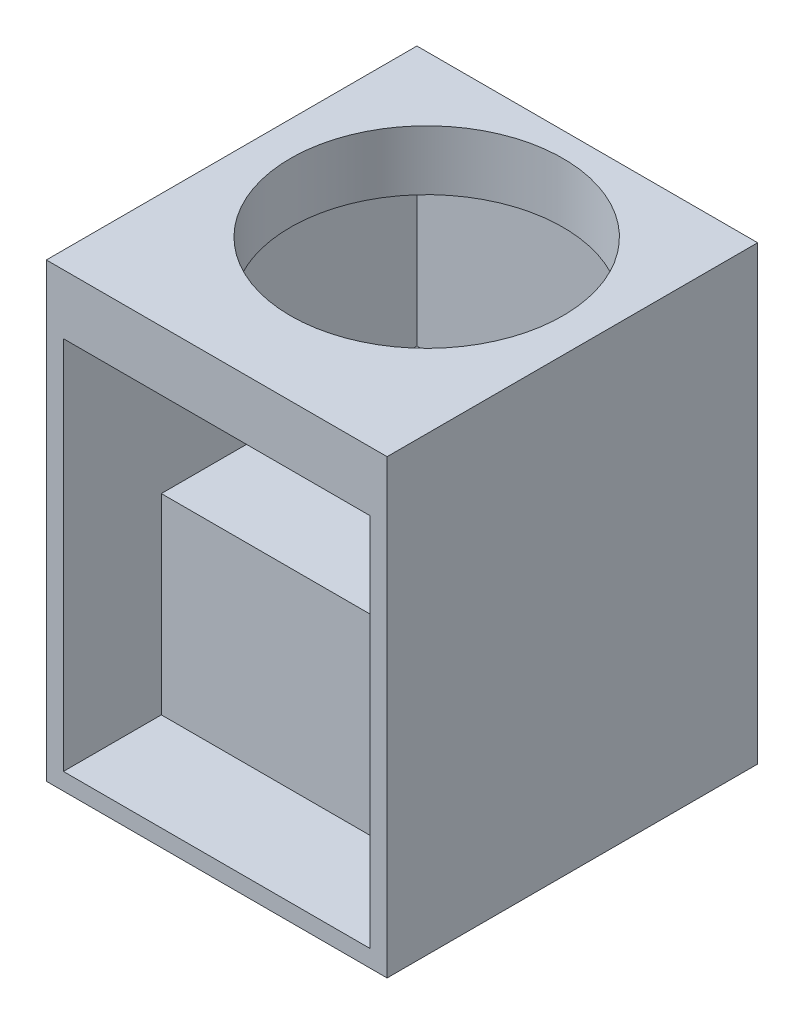
ISO-10303-21;
HEADER;
FILE_DESCRIPTION(('STEP AP214'),'2;1');
FILE_NAME('part.step','',(''),(''),'','','');
FILE_SCHEMA(('AUTOMOTIVE_DESIGN { 1 0 10303 214 1 1 1 1 }'));
ENDSEC;
DATA;
#1=APPLICATION_CONTEXT('core data for automotive mechanical design processes');
#2=APPLICATION_PROTOCOL_DEFINITION('international standard','automotive_design',2000,#1);
#3=PRODUCT_CONTEXT('',#1,'mechanical');
#4=PRODUCT('Part','Part','',(#3));
#5=PRODUCT_RELATED_PRODUCT_CATEGORY('part','',(#4));
#6=PRODUCT_DEFINITION_FORMATION('','',#4);
#7=PRODUCT_DEFINITION_CONTEXT('part definition',#1,'design');
#8=PRODUCT_DEFINITION('design','',#6,#7);
#9=PRODUCT_DEFINITION_SHAPE('','',#8);
#10=(LENGTH_UNIT() NAMED_UNIT(*) SI_UNIT(.MILLI.,.METRE.));
#11=(NAMED_UNIT(*) PLANE_ANGLE_UNIT() SI_UNIT($,.RADIAN.));
#12=(NAMED_UNIT(*) SI_UNIT($,.STERADIAN.) SOLID_ANGLE_UNIT());
#13=UNCERTAINTY_MEASURE_WITH_UNIT(LENGTH_MEASURE(1.E-05),#10,'distance_accuracy_value','');
#14=(GEOMETRIC_REPRESENTATION_CONTEXT(3) GLOBAL_UNCERTAINTY_ASSIGNED_CONTEXT((#13)) GLOBAL_UNIT_ASSIGNED_CONTEXT((#10,
#11,#12)) REPRESENTATION_CONTEXT('',''));
#15=CARTESIAN_POINT('',(0.,0.,0.));
#16=DIRECTION('',(0.,0.,1.));
#17=DIRECTION('',(1.,0.,0.));
#18=AXIS2_PLACEMENT_3D('',#15,#16,#17);
#19=CARTESIAN_POINT('',(-200.,480.,311.));
#20=DIRECTION('',(0.,0.,-1.));
#21=DIRECTION('',(-1.,0.,0.));
#22=AXIS2_PLACEMENT_3D('',#19,#20,#21);
#23=PLANE('',#22);
#24=DIRECTION('',(1.,0.,0.));
#25=VECTOR('',#24,1.);
#26=CARTESIAN_POINT('',(-200.,0.,311.));
#27=LINE('',#26,#25);
#28=CARTESIAN_POINT('',(-200.,0.,311.));
#29=VERTEX_POINT('',#28);
#30=CARTESIAN_POINT('',(200.,0.,311.));
#31=VERTEX_POINT('',#30);
#32=EDGE_CURVE('E294',#29,#31,#27,.T.);
#33=ORIENTED_EDGE('',*,*,#32,.T.);
#34=DIRECTION('',(0.,-1.,0.));
#35=VECTOR('',#34,1.);
#36=CARTESIAN_POINT('',(200.,480.,311.));
#37=LINE('',#36,#35);
#38=CARTESIAN_POINT('',(200.,530.,311.));
#39=VERTEX_POINT('',#38);
#40=EDGE_CURVE('E52',#39,#31,#37,.T.);
#41=ORIENTED_EDGE('',*,*,#40,.F.);
#42=DIRECTION('',(1.,0.,0.));
#43=VECTOR('',#42,1.);
#44=CARTESIAN_POINT('',(-200.,530.,311.));
#45=LINE('',#44,#43);
#46=CARTESIAN_POINT('',(-200.,530.,311.));
#47=VERTEX_POINT('',#46);
#48=EDGE_CURVE('E166',#47,#39,#45,.T.);
#49=ORIENTED_EDGE('',*,*,#48,.F.);
#50=DIRECTION('',(0.,-1.,0.));
#51=VECTOR('',#50,1.);
#52=CARTESIAN_POINT('',(-200.,480.,311.));
#53=LINE('',#52,#51);
#54=EDGE_CURVE('E11',#47,#29,#53,.T.);
#55=ORIENTED_EDGE('',*,*,#54,.T.);
#56=EDGE_LOOP('',(#33,#41,#49,#55));
#57=FACE_BOUND('',#56,.T.);
#58=DIRECTION('',(1.,0.,0.));
#59=VECTOR('',#58,1.);
#60=CARTESIAN_POINT('',(-200.,20.,311.));
#61=LINE('',#60,#59);
#62=CARTESIAN_POINT('',(-180.,20.,311.));
#63=VERTEX_POINT('',#62);
#64=CARTESIAN_POINT('',(180.,20.,311.));
#65=VERTEX_POINT('',#64);
#66=EDGE_CURVE('E189',#63,#65,#61,.T.);
#67=ORIENTED_EDGE('',*,*,#66,.F.);
#68=DIRECTION('',(0.,-1.,0.));
#69=VECTOR('',#68,1.);
#70=CARTESIAN_POINT('',(-180.,480.,311.));
#71=LINE('',#70,#69);
#72=CARTESIAN_POINT('',(-180.,460.,311.));
#73=VERTEX_POINT('',#72);
#74=EDGE_CURVE('E220',#73,#63,#71,.T.);
#75=ORIENTED_EDGE('',*,*,#74,.F.);
#76=DIRECTION('',(1.,0.,0.));
#77=VECTOR('',#76,1.);
#78=CARTESIAN_POINT('',(-200.,460.,311.));
#79=LINE('',#78,#77);
#80=CARTESIAN_POINT('',(180.,460.,311.));
#81=VERTEX_POINT('',#80);
#82=EDGE_CURVE('E193',#73,#81,#79,.T.);
#83=ORIENTED_EDGE('',*,*,#82,.T.);
#84=DIRECTION('',(0.,-1.,0.));
#85=VECTOR('',#84,1.);
#86=CARTESIAN_POINT('',(180.,480.,311.));
#87=LINE('',#86,#85);
#88=EDGE_CURVE('E211',#81,#65,#87,.T.);
#89=ORIENTED_EDGE('',*,*,#88,.T.);
#90=EDGE_LOOP('',(#67,#75,#83,#89));
#91=FACE_BOUND('',#90,.T.);
#92=ADVANCED_FACE('F43',(#57,#91),#23,.F.);
#93=CARTESIAN_POINT('',(-200.,480.,-124.));
#94=DIRECTION('',(1.,0.,0.));
#95=DIRECTION('',(0.,0.,-1.));
#96=AXIS2_PLACEMENT_3D('',#93,#94,#95);
#97=PLANE('',#96);
#98=DIRECTION('',(0.,0.,1.));
#99=VECTOR('',#98,1.);
#100=CARTESIAN_POINT('',(-200.,0.,-124.));
#101=LINE('',#100,#99);
#102=CARTESIAN_POINT('',(-200.,0.,-124.));
#103=VERTEX_POINT('',#102);
#104=EDGE_CURVE('E283',#103,#29,#101,.T.);
#105=ORIENTED_EDGE('',*,*,#104,.T.);
#106=ORIENTED_EDGE('',*,*,#54,.F.);
#107=DIRECTION('',(0.,0.,1.));
#108=VECTOR('',#107,1.);
#109=CARTESIAN_POINT('',(-200.,530.,-124.));
#110=LINE('',#109,#108);
#111=CARTESIAN_POINT('',(-200.,530.,-124.));
#112=VERTEX_POINT('',#111);
#113=EDGE_CURVE('E161',#112,#47,#110,.T.);
#114=ORIENTED_EDGE('',*,*,#113,.F.);
#115=DIRECTION('',(0.,-1.,0.));
#116=VECTOR('',#115,1.);
#117=CARTESIAN_POINT('',(-200.,480.,-124.));
#118=LINE('',#117,#116);
#119=EDGE_CURVE('E146',#112,#103,#118,.T.);
#120=ORIENTED_EDGE('',*,*,#119,.T.);
#121=EDGE_LOOP('',(#105,#106,#114,#120));
#122=FACE_BOUND('',#121,.T.);
#123=ADVANCED_FACE('F45',(#122),#97,.F.);
#124=CARTESIAN_POINT('',(200.,480.,-124.));
#125=DIRECTION('',(-1.,0.,0.));
#126=DIRECTION('',(0.,0.,1.));
#127=AXIS2_PLACEMENT_3D('',#124,#125,#126);
#128=PLANE('',#127);
#129=DIRECTION('',(0.,0.,-1.));
#130=VECTOR('',#129,1.);
#131=CARTESIAN_POINT('',(200.,0.,-124.));
#132=LINE('',#131,#130);
#133=CARTESIAN_POINT('',(200.,0.,-124.));
#134=VERTEX_POINT('',#133);
#135=EDGE_CURVE('E297',#31,#134,#132,.T.);
#136=ORIENTED_EDGE('',*,*,#135,.T.);
#137=DIRECTION('',(0.,-1.,0.));
#138=VECTOR('',#137,1.);
#139=CARTESIAN_POINT('',(200.,480.,-124.));
#140=LINE('',#139,#138);
#141=CARTESIAN_POINT('',(200.,530.,-124.));
#142=VERTEX_POINT('',#141);
#143=EDGE_CURVE('E158',#142,#134,#140,.T.);
#144=ORIENTED_EDGE('',*,*,#143,.F.);
#145=DIRECTION('',(0.,0.,-1.));
#146=VECTOR('',#145,1.);
#147=CARTESIAN_POINT('',(200.,530.,311.));
#148=LINE('',#147,#146);
#149=EDGE_CURVE('E171',#39,#142,#148,.T.);
#150=ORIENTED_EDGE('',*,*,#149,.F.);
#151=ORIENTED_EDGE('',*,*,#40,.T.);
#152=EDGE_LOOP('',(#136,#144,#150,#151));
#153=FACE_BOUND('',#152,.T.);
#154=ADVANCED_FACE('F307',(#153),#128,.F.);
#155=CARTESIAN_POINT('',(-200.,480.,-124.));
#156=DIRECTION('',(0.,0.,1.));
#157=DIRECTION('',(1.,0.,0.));
#158=AXIS2_PLACEMENT_3D('',#155,#156,#157);
#159=PLANE('',#158);
#160=DIRECTION('',(-1.,0.,0.));
#161=VECTOR('',#160,1.);
#162=CARTESIAN_POINT('',(175.,25.,-124.));
#163=LINE('',#162,#161);
#164=CARTESIAN_POINT('',(175.,25.,-124.));
#165=VERTEX_POINT('',#164);
#166=CARTESIAN_POINT('',(-175.,25.,-124.));
#167=VERTEX_POINT('',#166);
#168=EDGE_CURVE('E269',#165,#167,#163,.T.);
#169=ORIENTED_EDGE('',*,*,#168,.F.);
#170=DIRECTION('',(0.,-1.,0.));
#171=VECTOR('',#170,1.);
#172=CARTESIAN_POINT('',(175.,225.,-124.));
#173=LINE('',#172,#171);
#174=CARTESIAN_POINT('',(175.,225.,-124.));
#175=VERTEX_POINT('',#174);
#176=EDGE_CURVE('E67',#175,#165,#173,.T.);
#177=ORIENTED_EDGE('',*,*,#176,.F.);
#178=DIRECTION('',(1.,0.,0.));
#179=VECTOR('',#178,1.);
#180=CARTESIAN_POINT('',(175.,225.,-124.));
#181=LINE('',#180,#179);
#182=CARTESIAN_POINT('',(-175.,225.,-124.));
#183=VERTEX_POINT('',#182);
#184=EDGE_CURVE('E254',#183,#175,#181,.T.);
#185=ORIENTED_EDGE('',*,*,#184,.F.);
#186=DIRECTION('',(0.,1.,0.));
#187=VECTOR('',#186,1.);
#188=CARTESIAN_POINT('',(-175.,225.,-124.));
#189=LINE('',#188,#187);
#190=EDGE_CURVE('E273',#167,#183,#189,.T.);
#191=ORIENTED_EDGE('',*,*,#190,.F.);
#192=EDGE_LOOP('',(#169,#177,#185,#191));
#193=FACE_BOUND('',#192,.T.);
#194=DIRECTION('',(-1.,0.,0.));
#195=VECTOR('',#194,1.);
#196=CARTESIAN_POINT('',(-200.,0.,-124.));
#197=LINE('',#196,#195);
#198=EDGE_CURVE('E153',#134,#103,#197,.T.);
#199=ORIENTED_EDGE('',*,*,#198,.T.);
#200=ORIENTED_EDGE('',*,*,#119,.F.);
#201=DIRECTION('',(-1.,0.,0.));
#202=VECTOR('',#201,1.);
#203=CARTESIAN_POINT('',(200.,530.,-124.));
#204=LINE('',#203,#202);
#205=EDGE_CURVE('E151',#142,#112,#204,.T.);
#206=ORIENTED_EDGE('',*,*,#205,.F.);
#207=ORIENTED_EDGE('',*,*,#143,.T.);
#208=EDGE_LOOP('',(#199,#200,#206,#207));
#209=FACE_BOUND('',#208,.T.);
#210=ADVANCED_FACE('F148',(#193,#209),#159,.F.);
#211=CARTESIAN_POINT('',(0.,0.,0.));
#212=DIRECTION('',(0.,1.,0.));
#213=DIRECTION('',(0.,0.,1.));
#214=AXIS2_PLACEMENT_3D('',#211,#212,#213);
#215=PLANE('',#214);
#216=ORIENTED_EDGE('',*,*,#104,.F.);
#217=ORIENTED_EDGE('',*,*,#198,.F.);
#218=ORIENTED_EDGE('',*,*,#135,.F.);
#219=ORIENTED_EDGE('',*,*,#32,.F.);
#220=EDGE_LOOP('',(#216,#217,#218,#219));
#221=FACE_BOUND('',#220,.T.);
#222=ADVANCED_FACE('F310',(#221),#215,.F.);
#223=CARTESIAN_POINT('',(175.,225.,176.));
#224=DIRECTION('',(1.,0.,0.));
#225=DIRECTION('',(0.,0.,-1.));
#226=AXIS2_PLACEMENT_3D('',#223,#224,#225);
#227=PLANE('',#226);
#228=ORIENTED_EDGE('',*,*,#176,.T.);
#229=DIRECTION('',(0.,0.,-1.));
#230=VECTOR('',#229,1.);
#231=CARTESIAN_POINT('',(175.,25.,176.));
#232=LINE('',#231,#230);
#233=CARTESIAN_POINT('',(175.,25.,176.));
#234=VERTEX_POINT('',#233);
#235=EDGE_CURVE('E266',#234,#165,#232,.T.);
#236=ORIENTED_EDGE('',*,*,#235,.F.);
#237=DIRECTION('',(0.,-1.,0.));
#238=VECTOR('',#237,1.);
#239=CARTESIAN_POINT('',(175.,225.,176.));
#240=LINE('',#239,#238);
#241=CARTESIAN_POINT('',(175.,225.,176.));
#242=VERTEX_POINT('',#241);
#243=EDGE_CURVE('E249',#242,#234,#240,.T.);
#244=ORIENTED_EDGE('',*,*,#243,.F.);
#245=DIRECTION('',(0.,0.,-1.));
#246=VECTOR('',#245,1.);
#247=CARTESIAN_POINT('',(175.,225.,176.));
#248=LINE('',#247,#246);
#249=EDGE_CURVE('E280',#242,#175,#248,.T.);
#250=ORIENTED_EDGE('',*,*,#249,.T.);
#251=EDGE_LOOP('',(#228,#236,#244,#250));
#252=FACE_BOUND('',#251,.T.);
#253=ADVANCED_FACE('F361',(#252),#227,.F.);
#254=CARTESIAN_POINT('',(175.,225.,176.));
#255=DIRECTION('',(0.,1.,0.));
#256=DIRECTION('',(0.,0.,1.));
#257=AXIS2_PLACEMENT_3D('',#254,#255,#256);
#258=PLANE('',#257);
#259=CARTESIAN_POINT('',(0.,225.,-20.));
#260=DIRECTION('',(0.,1.,0.));
#261=DIRECTION('',(0.,0.,1.));
#262=AXIS2_PLACEMENT_3D('',#259,#260,#261);
#263=CIRCLE('',#262,42.5);
#264=CARTESIAN_POINT('',(0.,225.,22.5));
#265=VERTEX_POINT('',#264);
#266=EDGE_CURVE('E560',#265,#265,#263,.F.);
#267=ORIENTED_EDGE('',*,*,#266,.F.);
#268=EDGE_LOOP('',(#267));
#269=FACE_BOUND('',#268,.T.);
#270=ORIENTED_EDGE('',*,*,#184,.T.);
#271=ORIENTED_EDGE('',*,*,#249,.F.);
#272=DIRECTION('',(1.,0.,0.));
#273=VECTOR('',#272,1.);
#274=CARTESIAN_POINT('',(175.,225.,176.));
#275=LINE('',#274,#273);
#276=CARTESIAN_POINT('',(-175.,225.,176.));
#277=VERTEX_POINT('',#276);
#278=EDGE_CURVE('E262',#277,#242,#275,.T.);
#279=ORIENTED_EDGE('',*,*,#278,.F.);
#280=DIRECTION('',(0.,0.,-1.));
#281=VECTOR('',#280,1.);
#282=CARTESIAN_POINT('',(-175.,225.,176.));
#283=LINE('',#282,#281);
#284=EDGE_CURVE('E284',#277,#183,#283,.T.);
#285=ORIENTED_EDGE('',*,*,#284,.T.);
#286=EDGE_LOOP('',(#270,#271,#279,#285));
#287=FACE_BOUND('',#286,.T.);
#288=ADVANCED_FACE('F357',(#269,#287),#258,.F.);
#289=CARTESIAN_POINT('',(-175.,225.,176.));
#290=DIRECTION('',(-1.,0.,0.));
#291=DIRECTION('',(0.,0.,1.));
#292=AXIS2_PLACEMENT_3D('',#289,#290,#291);
#293=PLANE('',#292);
#294=ORIENTED_EDGE('',*,*,#190,.T.);
#295=ORIENTED_EDGE('',*,*,#284,.F.);
#296=DIRECTION('',(0.,1.,0.));
#297=VECTOR('',#296,1.);
#298=CARTESIAN_POINT('',(-175.,225.,176.));
#299=LINE('',#298,#297);
#300=CARTESIAN_POINT('',(-175.,25.,176.));
#301=VERTEX_POINT('',#300);
#302=EDGE_CURVE('E258',#301,#277,#299,.T.);
#303=ORIENTED_EDGE('',*,*,#302,.F.);
#304=DIRECTION('',(0.,0.,-1.));
#305=VECTOR('',#304,1.);
#306=CARTESIAN_POINT('',(-175.,25.,176.));
#307=LINE('',#306,#305);
#308=EDGE_CURVE('E287',#301,#167,#307,.T.);
#309=ORIENTED_EDGE('',*,*,#308,.T.);
#310=EDGE_LOOP('',(#294,#295,#303,#309));
#311=FACE_BOUND('',#310,.T.);
#312=ADVANCED_FACE('F360',(#311),#293,.F.);
#313=CARTESIAN_POINT('',(175.,25.,176.));
#314=DIRECTION('',(0.,-1.,0.));
#315=DIRECTION('',(0.,0.,-1.));
#316=AXIS2_PLACEMENT_3D('',#313,#314,#315);
#317=PLANE('',#316);
#318=ORIENTED_EDGE('',*,*,#168,.T.);
#319=ORIENTED_EDGE('',*,*,#308,.F.);
#320=DIRECTION('',(-1.,0.,0.));
#321=VECTOR('',#320,1.);
#322=CARTESIAN_POINT('',(175.,25.,176.));
#323=LINE('',#322,#321);
#324=EDGE_CURVE('E253',#234,#301,#323,.T.);
#325=ORIENTED_EDGE('',*,*,#324,.F.);
#326=ORIENTED_EDGE('',*,*,#235,.T.);
#327=EDGE_LOOP('',(#318,#319,#325,#326));
#328=FACE_BOUND('',#327,.T.);
#329=ADVANCED_FACE('F336',(#328),#317,.F.);
#330=CARTESIAN_POINT('',(0.,0.,176.));
#331=DIRECTION('',(0.,0.,-1.));
#332=DIRECTION('',(-1.,0.,0.));
#333=AXIS2_PLACEMENT_3D('',#330,#331,#332);
#334=PLANE('',#333);
#335=ORIENTED_EDGE('',*,*,#243,.T.);
#336=ORIENTED_EDGE('',*,*,#324,.T.);
#337=ORIENTED_EDGE('',*,*,#302,.T.);
#338=ORIENTED_EDGE('',*,*,#278,.T.);
#339=EDGE_LOOP('',(#335,#336,#337,#338));
#340=FACE_BOUND('',#339,.T.);
#341=ADVANCED_FACE('F328',(#340),#334,.T.);
#342=CARTESIAN_POINT('',(-180.,480.,-124.));
#343=DIRECTION('',(1.,0.,0.));
#344=DIRECTION('',(0.,0.,-1.));
#345=AXIS2_PLACEMENT_3D('',#342,#343,#344);
#346=PLANE('',#345);
#347=DIRECTION('',(0.,1.,0.));
#348=VECTOR('',#347,1.);
#349=CARTESIAN_POINT('',(-180.,480.,196.));
#350=LINE('',#349,#348);
#351=CARTESIAN_POINT('',(-180.,20.,196.));
#352=VERTEX_POINT('',#351);
#353=CARTESIAN_POINT('',(-180.,245.,196.));
#354=VERTEX_POINT('',#353);
#355=EDGE_CURVE('E239',#352,#354,#350,.T.);
#356=ORIENTED_EDGE('',*,*,#355,.T.);
#357=DIRECTION('',(0.,0.,1.));
#358=VECTOR('',#357,1.);
#359=CARTESIAN_POINT('',(-180.,245.,-124.));
#360=LINE('',#359,#358);
#361=CARTESIAN_POINT('',(-180.,245.,-104.));
#362=VERTEX_POINT('',#361);
#363=EDGE_CURVE('E223',#362,#354,#360,.T.);
#364=ORIENTED_EDGE('',*,*,#363,.F.);
#365=DIRECTION('',(0.,-1.,0.));
#366=VECTOR('',#365,1.);
#367=CARTESIAN_POINT('',(-180.,480.,-104.));
#368=LINE('',#367,#366);
#369=CARTESIAN_POINT('',(-180.,460.,-104.));
#370=VERTEX_POINT('',#369);
#371=EDGE_CURVE('E195',#370,#362,#368,.T.);
#372=ORIENTED_EDGE('',*,*,#371,.F.);
#373=DIRECTION('',(0.,0.,1.));
#374=VECTOR('',#373,1.);
#375=CARTESIAN_POINT('',(-180.,460.,-124.));
#376=LINE('',#375,#374);
#377=EDGE_CURVE('E59',#370,#73,#376,.T.);
#378=ORIENTED_EDGE('',*,*,#377,.T.);
#379=ORIENTED_EDGE('',*,*,#74,.T.);
#380=DIRECTION('',(0.,0.,1.));
#381=VECTOR('',#380,1.);
#382=CARTESIAN_POINT('',(-180.,20.,-124.));
#383=LINE('',#382,#381);
#384=EDGE_CURVE('E186',#352,#63,#383,.T.);
#385=ORIENTED_EDGE('',*,*,#384,.F.);
#386=EDGE_LOOP('',(#356,#364,#372,#378,#379,#385));
#387=FACE_BOUND('',#386,.T.);
#388=ADVANCED_FACE('F326',(#387),#346,.T.);
#389=CARTESIAN_POINT('',(180.,480.,-124.));
#390=DIRECTION('',(-1.,0.,0.));
#391=DIRECTION('',(0.,0.,1.));
#392=AXIS2_PLACEMENT_3D('',#389,#390,#391);
#393=PLANE('',#392);
#394=DIRECTION('',(0.,0.,-1.));
#395=VECTOR('',#394,1.);
#396=CARTESIAN_POINT('',(180.,20.,-124.));
#397=LINE('',#396,#395);
#398=CARTESIAN_POINT('',(180.,20.,196.));
#399=VERTEX_POINT('',#398);
#400=EDGE_CURVE('E194',#65,#399,#397,.T.);
#401=ORIENTED_EDGE('',*,*,#400,.F.);
#402=ORIENTED_EDGE('',*,*,#88,.F.);
#403=DIRECTION('',(0.,0.,-1.));
#404=VECTOR('',#403,1.);
#405=CARTESIAN_POINT('',(180.,460.,-124.));
#406=LINE('',#405,#404);
#407=CARTESIAN_POINT('',(180.,460.,-104.));
#408=VERTEX_POINT('',#407);
#409=EDGE_CURVE('E207',#81,#408,#406,.T.);
#410=ORIENTED_EDGE('',*,*,#409,.T.);
#411=DIRECTION('',(0.,-1.,0.));
#412=VECTOR('',#411,1.);
#413=CARTESIAN_POINT('',(180.,480.,-104.));
#414=LINE('',#413,#412);
#415=CARTESIAN_POINT('',(180.,245.,-104.));
#416=VERTEX_POINT('',#415);
#417=EDGE_CURVE('E199',#408,#416,#414,.T.);
#418=ORIENTED_EDGE('',*,*,#417,.T.);
#419=DIRECTION('',(0.,0.,1.));
#420=VECTOR('',#419,1.);
#421=CARTESIAN_POINT('',(180.,245.,176.));
#422=LINE('',#421,#420);
#423=CARTESIAN_POINT('',(180.,245.,196.));
#424=VERTEX_POINT('',#423);
#425=EDGE_CURVE('E235',#416,#424,#422,.T.);
#426=ORIENTED_EDGE('',*,*,#425,.T.);
#427=DIRECTION('',(0.,1.,0.));
#428=VECTOR('',#427,1.);
#429=CARTESIAN_POINT('',(180.,0.,196.));
#430=LINE('',#429,#428);
#431=EDGE_CURVE('E242',#399,#424,#430,.T.);
#432=ORIENTED_EDGE('',*,*,#431,.F.);
#433=EDGE_LOOP('',(#401,#402,#410,#418,#426,#432));
#434=FACE_BOUND('',#433,.T.);
#435=ADVANCED_FACE('F320',(#434),#393,.T.);
#436=CARTESIAN_POINT('',(-200.,480.,-104.));
#437=DIRECTION('',(0.,0.,1.));
#438=DIRECTION('',(1.,0.,0.));
#439=AXIS2_PLACEMENT_3D('',#436,#437,#438);
#440=PLANE('',#439);
#441=DIRECTION('',(1.,0.,0.));
#442=VECTOR('',#441,1.);
#443=CARTESIAN_POINT('',(175.,245.,-104.));
#444=LINE('',#443,#442);
#445=EDGE_CURVE('E185',#362,#416,#444,.T.);
#446=ORIENTED_EDGE('',*,*,#445,.T.);
#447=ORIENTED_EDGE('',*,*,#417,.F.);
#448=DIRECTION('',(-1.,0.,0.));
#449=VECTOR('',#448,1.);
#450=CARTESIAN_POINT('',(-200.,460.,-104.));
#451=LINE('',#450,#449);
#452=EDGE_CURVE('E200',#408,#370,#451,.T.);
#453=ORIENTED_EDGE('',*,*,#452,.T.);
#454=ORIENTED_EDGE('',*,*,#371,.T.);
#455=EDGE_LOOP('',(#446,#447,#453,#454));
#456=FACE_BOUND('',#455,.T.);
#457=ADVANCED_FACE('F334',(#456),#440,.T.);
#458=CARTESIAN_POINT('',(0.,460.,0.));
#459=DIRECTION('',(0.,1.,0.));
#460=DIRECTION('',(0.,0.,1.));
#461=AXIS2_PLACEMENT_3D('',#458,#459,#460);
#462=PLANE('',#461);
#463=CARTESIAN_POINT('',(0.,460.,64.5));
#464=DIRECTION('',(0.,1.,0.));
#465=DIRECTION('',(0.,0.,1.));
#466=AXIS2_PLACEMENT_3D('',#463,#464,#465);
#467=CIRCLE('',#466,160.);
#468=CARTESIAN_POINT('',(0.,460.,224.5));
#469=VERTEX_POINT('',#468);
#470=EDGE_CURVE('E173',#469,#469,#467,.F.);
#471=ORIENTED_EDGE('',*,*,#470,.F.);
#472=EDGE_LOOP('',(#471));
#473=FACE_BOUND('',#472,.T.);
#474=ORIENTED_EDGE('',*,*,#377,.F.);
#475=ORIENTED_EDGE('',*,*,#452,.F.);
#476=ORIENTED_EDGE('',*,*,#409,.F.);
#477=ORIENTED_EDGE('',*,*,#82,.F.);
#478=EDGE_LOOP('',(#474,#475,#476,#477));
#479=FACE_BOUND('',#478,.T.);
#480=ADVANCED_FACE('F344',(#473,#479),#462,.F.);
#481=CARTESIAN_POINT('',(0.,20.,0.));
#482=DIRECTION('',(0.,1.,0.));
#483=DIRECTION('',(0.,0.,1.));
#484=AXIS2_PLACEMENT_3D('',#481,#482,#483);
#485=PLANE('',#484);
#486=ORIENTED_EDGE('',*,*,#384,.T.);
#487=ORIENTED_EDGE('',*,*,#66,.T.);
#488=ORIENTED_EDGE('',*,*,#400,.T.);
#489=DIRECTION('',(1.,0.,0.));
#490=VECTOR('',#489,1.);
#491=CARTESIAN_POINT('',(0.,20.,196.));
#492=LINE('',#491,#490);
#493=EDGE_CURVE('E245',#352,#399,#492,.T.);
#494=ORIENTED_EDGE('',*,*,#493,.F.);
#495=EDGE_LOOP('',(#486,#487,#488,#494));
#496=FACE_BOUND('',#495,.T.);
#497=ADVANCED_FACE('F317',(#496),#485,.T.);
#498=CARTESIAN_POINT('',(175.,245.,176.));
#499=DIRECTION('',(0.,1.,0.));
#500=DIRECTION('',(0.,0.,1.));
#501=AXIS2_PLACEMENT_3D('',#498,#499,#500);
#502=PLANE('',#501);
#503=CARTESIAN_POINT('',(0.,245.,-20.));
#504=DIRECTION('',(0.,1.,0.));
#505=DIRECTION('',(0.,0.,1.));
#506=AXIS2_PLACEMENT_3D('',#503,#504,#505);
#507=CIRCLE('',#506,42.5);
#508=CARTESIAN_POINT('',(0.,245.,22.5));
#509=VERTEX_POINT('',#508);
#510=EDGE_CURVE('E563',#509,#509,#507,.T.);
#511=ORIENTED_EDGE('',*,*,#510,.F.);
#512=EDGE_LOOP('',(#511));
#513=FACE_BOUND('',#512,.T.);
#514=ORIENTED_EDGE('',*,*,#445,.F.);
#515=ORIENTED_EDGE('',*,*,#363,.T.);
#516=DIRECTION('',(1.,0.,0.));
#517=VECTOR('',#516,1.);
#518=CARTESIAN_POINT('',(0.,245.,196.));
#519=LINE('',#518,#517);
#520=EDGE_CURVE('E190',#354,#424,#519,.T.);
#521=ORIENTED_EDGE('',*,*,#520,.T.);
#522=ORIENTED_EDGE('',*,*,#425,.F.);
#523=EDGE_LOOP('',(#514,#515,#521,#522));
#524=FACE_BOUND('',#523,.T.);
#525=ADVANCED_FACE('F351',(#513,#524),#502,.T.);
#526=CARTESIAN_POINT('',(0.,0.,196.));
#527=DIRECTION('',(0.,0.,-1.));
#528=DIRECTION('',(-1.,0.,0.));
#529=AXIS2_PLACEMENT_3D('',#526,#527,#528);
#530=PLANE('',#529);
#531=ORIENTED_EDGE('',*,*,#493,.T.);
#532=ORIENTED_EDGE('',*,*,#431,.T.);
#533=ORIENTED_EDGE('',*,*,#520,.F.);
#534=ORIENTED_EDGE('',*,*,#355,.F.);
#535=EDGE_LOOP('',(#531,#532,#533,#534));
#536=FACE_BOUND('',#535,.T.);
#537=ADVANCED_FACE('F325',(#536),#530,.F.);
#538=CARTESIAN_POINT('',(0.,530.,0.));
#539=DIRECTION('',(0.,1.,0.));
#540=DIRECTION('',(0.,0.,1.));
#541=AXIS2_PLACEMENT_3D('',#538,#539,#540);
#542=PLANE('',#541);
#543=CARTESIAN_POINT('',(0.,530.,64.5));
#544=DIRECTION('',(0.,1.,0.));
#545=DIRECTION('',(0.,0.,1.));
#546=AXIS2_PLACEMENT_3D('',#543,#544,#545);
#547=CIRCLE('',#546,160.);
#548=CARTESIAN_POINT('',(0.,530.,224.5));
#549=VERTEX_POINT('',#548);
#550=EDGE_CURVE('E177',#549,#549,#547,.T.);
#551=ORIENTED_EDGE('',*,*,#550,.F.);
#552=EDGE_LOOP('',(#551));
#553=FACE_BOUND('',#552,.T.);
#554=ORIENTED_EDGE('',*,*,#205,.T.);
#555=ORIENTED_EDGE('',*,*,#113,.T.);
#556=ORIENTED_EDGE('',*,*,#48,.T.);
#557=ORIENTED_EDGE('',*,*,#149,.T.);
#558=EDGE_LOOP('',(#554,#555,#556,#557));
#559=FACE_BOUND('',#558,.T.);
#560=ADVANCED_FACE('F169',(#553,#559),#542,.T.);
#561=CARTESIAN_POINT('',(0.,7.4516600406096,64.5));
#562=DIRECTION('',(0.,1.,0.));
#563=DIRECTION('',(0.,0.,1.));
#564=AXIS2_PLACEMENT_3D('',#561,#562,#563);
#565=CYLINDRICAL_SURFACE('',#564,160.);
#566=ORIENTED_EDGE('',*,*,#470,.T.);
#567=EDGE_LOOP('',(#566));
#568=FACE_BOUND('',#567,.T.);
#569=ORIENTED_EDGE('',*,*,#550,.T.);
#570=EDGE_LOOP('',(#569));
#571=FACE_BOUND('',#570,.T.);
#572=ADVANCED_FACE('F483',(#568,#571),#565,.F.);
#573=CARTESIAN_POINT('',(0.,104.791847198287,-20.));
#574=DIRECTION('',(0.,1.,0.));
#575=DIRECTION('',(0.,0.,1.));
#576=AXIS2_PLACEMENT_3D('',#573,#574,#575);
#577=CYLINDRICAL_SURFACE('',#576,42.5);
#578=ORIENTED_EDGE('',*,*,#266,.T.);
#579=EDGE_LOOP('',(#578));
#580=FACE_BOUND('',#579,.T.);
#581=ORIENTED_EDGE('',*,*,#510,.T.);
#582=EDGE_LOOP('',(#581));
#583=FACE_BOUND('',#582,.T.);
#584=ADVANCED_FACE('F493',(#580,#583),#577,.F.);
#585=CLOSED_SHELL('',(#92,#123,#154,#210,#222,#253,#288,#312,#329,#341,#388,#435,#457,#480,#497,
#525,#537,#560,#572,#584));
#586=MANIFOLD_SOLID_BREP('B2',#585);
#587=ADVANCED_BREP_SHAPE_REPRESENTATION('',(#18,#586),#14);
#588=SHAPE_DEFINITION_REPRESENTATION(#9,#587);
ENDSEC;
END-ISO-10303-21;
